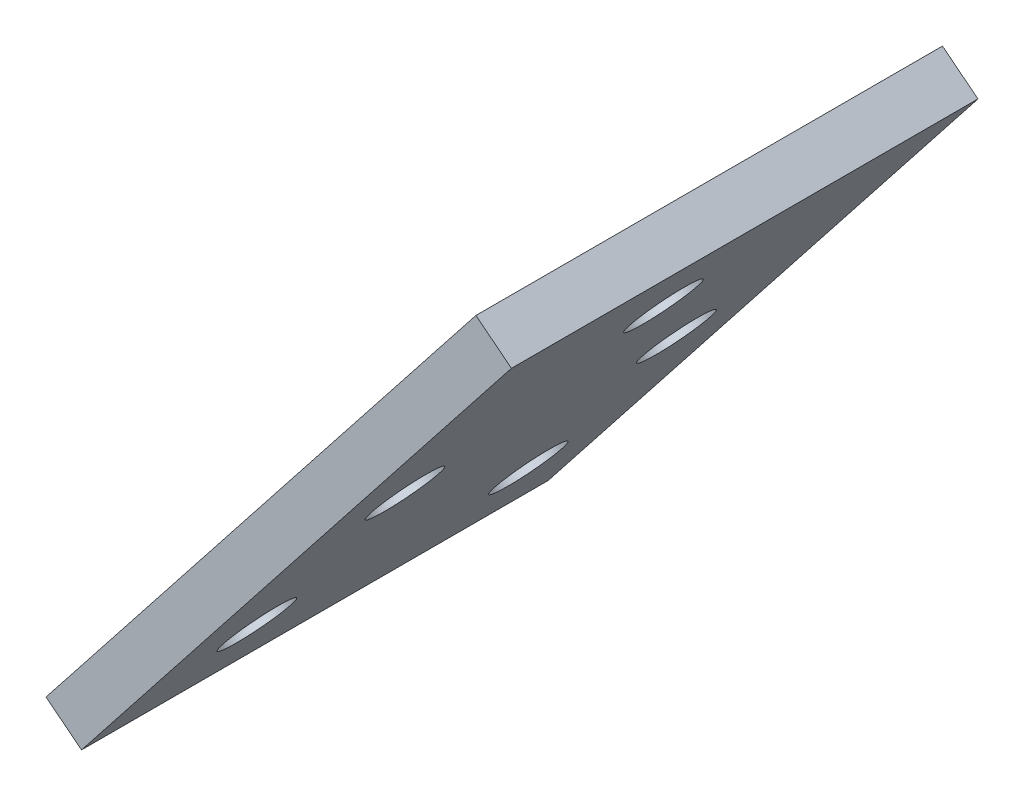
ISO-10303-21;
HEADER;
FILE_DESCRIPTION(('STEP AP214'),'2;1');
FILE_NAME('part.step','',(''),(''),'','','');
FILE_SCHEMA(('AUTOMOTIVE_DESIGN { 1 0 10303 214 1 1 1 1 }'));
ENDSEC;
DATA;
#1=APPLICATION_CONTEXT('core data for automotive mechanical design processes');
#2=APPLICATION_PROTOCOL_DEFINITION('international standard','automotive_design',2000,#1);
#3=PRODUCT_CONTEXT('',#1,'mechanical');
#4=PRODUCT('Part','Part','',(#3));
#5=PRODUCT_RELATED_PRODUCT_CATEGORY('part','',(#4));
#6=PRODUCT_DEFINITION_FORMATION('','',#4);
#7=PRODUCT_DEFINITION_CONTEXT('part definition',#1,'design');
#8=PRODUCT_DEFINITION('design','',#6,#7);
#9=PRODUCT_DEFINITION_SHAPE('','',#8);
#10=(LENGTH_UNIT() NAMED_UNIT(*) SI_UNIT(.MILLI.,.METRE.));
#11=(NAMED_UNIT(*) PLANE_ANGLE_UNIT() SI_UNIT($,.RADIAN.));
#12=(NAMED_UNIT(*) SI_UNIT($,.STERADIAN.) SOLID_ANGLE_UNIT());
#13=UNCERTAINTY_MEASURE_WITH_UNIT(LENGTH_MEASURE(1.E-05),#10,'distance_accuracy_value','');
#14=(GEOMETRIC_REPRESENTATION_CONTEXT(3) GLOBAL_UNCERTAINTY_ASSIGNED_CONTEXT((#13)) GLOBAL_UNIT_ASSIGNED_CONTEXT((#10,
#11,#12)) REPRESENTATION_CONTEXT('',''));
#15=CARTESIAN_POINT('',(0.,0.,0.));
#16=DIRECTION('',(0.,0.,1.));
#17=DIRECTION('',(1.,0.,0.));
#18=AXIS2_PLACEMENT_3D('',#15,#16,#17);
#19=CARTESIAN_POINT('',(1059.31573815368,-834.916688530996,0.));
#20=DIRECTION('',(-0.785381990859347,0.619011412199976,0.));
#21=DIRECTION('',(-0.619011412199976,-0.785381990859347,0.));
#22=AXIS2_PLACEMENT_3D('',#19,#20,#21);
#23=PLANE('',#22);
#24=CARTESIAN_POINT('',(2098.35710282422,483.385946100461,531.259663272656));
#25=DIRECTION('',(-0.785381990859347,0.619011412199975,0.));
#26=DIRECTION('',(-0.619011412199975,-0.785381990859347,0.));
#27=AXIS2_PLACEMENT_3D('',#24,#25,#26);
#28=CIRCLE('',#27,4.76249999999999);
#29=CARTESIAN_POINT('',(2095.40906097362,479.645564368993,531.259663272656));
#30=VERTEX_POINT('',#29);
#31=EDGE_CURVE('E133',#30,#30,#28,.T.);
#32=ORIENTED_EDGE('',*,*,#31,.F.);
#33=EDGE_LOOP('',(#32));
#34=FACE_BOUND('',#33,.T.);
#35=CARTESIAN_POINT('',(2119.14630906955,509.76262974077,493.159663272656));
#36=DIRECTION('',(-0.785381990859347,0.619011412199975,0.));
#37=DIRECTION('',(-0.619011412199975,-0.785381990859347,0.));
#38=AXIS2_PLACEMENT_3D('',#35,#36,#37);
#39=CIRCLE('',#38,4.76249999999999);
#40=CARTESIAN_POINT('',(2116.19826721895,506.022248009302,493.159663272656));
#41=VERTEX_POINT('',#40);
#42=EDGE_CURVE('E121',#41,#41,#39,.T.);
#43=ORIENTED_EDGE('',*,*,#42,.F.);
#44=EDGE_LOOP('',(#43));
#45=FACE_BOUND('',#44,.T.);
#46=DIRECTION('',(-0.619011412199975,-0.785381990859347,0.));
#47=VECTOR('',#46,1.);
#48=CARTESIAN_POINT('',(2147.76876175859,546.077887316234,479.477350202418));
#49=LINE('',#48,#47);
#50=CARTESIAN_POINT('',(2147.76876175859,546.077887316234,479.477350202418));
#51=VERTEX_POINT('',#50);
#52=CARTESIAN_POINT('',(2087.44633107142,469.5427059402,479.477350202418));
#53=VERTEX_POINT('',#52);
#54=EDGE_CURVE('E91',#51,#53,#49,.T.);
#55=ORIENTED_EDGE('',*,*,#54,.T.);
#56=DIRECTION('',(0.,0.,1.));
#57=VECTOR('',#56,1.);
#58=CARTESIAN_POINT('',(2087.44633107142,469.5427059402,479.477350202418));
#59=LINE('',#58,#57);
#60=CARTESIAN_POINT('',(2087.44633107142,469.5427059402,544.941976342895));
#61=VERTEX_POINT('',#60);
#62=EDGE_CURVE('E86',#53,#61,#59,.T.);
#63=ORIENTED_EDGE('',*,*,#62,.T.);
#64=DIRECTION('',(0.619011412199975,0.785381990859347,0.));
#65=VECTOR('',#64,1.);
#66=CARTESIAN_POINT('',(2147.76876175859,546.077887316234,544.941976342895));
#67=LINE('',#66,#65);
#68=CARTESIAN_POINT('',(2147.76876175859,546.077887316234,544.941976342895));
#69=VERTEX_POINT('',#68);
#70=EDGE_CURVE('E89',#61,#69,#67,.T.);
#71=ORIENTED_EDGE('',*,*,#70,.T.);
#72=DIRECTION('',(0.,0.,-1.));
#73=VECTOR('',#72,1.);
#74=CARTESIAN_POINT('',(2147.76876175859,546.077887316234,479.477350202418));
#75=LINE('',#74,#73);
#76=EDGE_CURVE('E56',#69,#51,#75,.T.);
#77=ORIENTED_EDGE('',*,*,#76,.T.);
#78=EDGE_LOOP('',(#55,#63,#71,#77));
#79=FACE_BOUND('',#78,.T.);
#80=CARTESIAN_POINT('',(2136.36236998439,531.605820237053,512.209663272656));
#81=DIRECTION('',(-0.785381990859347,0.619011412199975,0.));
#82=DIRECTION('',(-0.619011412199975,-0.785381990859347,0.));
#83=AXIS2_PLACEMENT_3D('',#80,#81,#82);
#84=CIRCLE('',#83,4.76250000000007);
#85=CARTESIAN_POINT('',(2133.41432813379,527.865438505585,512.209663272656));
#86=VERTEX_POINT('',#85);
#87=EDGE_CURVE('E106',#86,#86,#84,.T.);
#88=ORIENTED_EDGE('',*,*,#87,.F.);
#89=EDGE_LOOP('',(#88));
#90=FACE_BOUND('',#89,.T.);
#91=CARTESIAN_POINT('',(2119.14630906955,509.76262974077,531.259663272656));
#92=DIRECTION('',(-0.785381990859347,0.619011412199975,0.));
#93=DIRECTION('',(-0.619011412199975,-0.785381990859347,0.));
#94=AXIS2_PLACEMENT_3D('',#91,#92,#93);
#95=CIRCLE('',#94,4.76249999999999);
#96=CARTESIAN_POINT('',(2116.19826721895,506.022248009302,531.259663272656));
#97=VERTEX_POINT('',#96);
#98=EDGE_CURVE('E127',#97,#97,#95,.T.);
#99=ORIENTED_EDGE('',*,*,#98,.F.);
#100=EDGE_LOOP('',(#99));
#101=FACE_BOUND('',#100,.T.);
#102=CARTESIAN_POINT('',(2098.35710282422,483.385946100461,493.159663272656));
#103=DIRECTION('',(-0.785381990859347,0.619011412199975,0.));
#104=DIRECTION('',(-0.619011412199975,-0.785381990859347,0.));
#105=AXIS2_PLACEMENT_3D('',#102,#103,#104);
#106=CIRCLE('',#105,4.76249999999999);
#107=CARTESIAN_POINT('',(2095.40906097362,479.645564368993,493.159663272656));
#108=VERTEX_POINT('',#107);
#109=EDGE_CURVE('E139',#108,#108,#106,.T.);
#110=ORIENTED_EDGE('',*,*,#109,.F.);
#111=EDGE_LOOP('',(#110));
#112=FACE_BOUND('',#111,.T.);
#113=ADVANCED_FACE('F39',(#34,#45,#79,#90,#101,#112),#23,.T.);
#114=CARTESIAN_POINT('',(1064.30291379563,-838.847410998466,0.));
#115=DIRECTION('',(-0.785381990859347,0.619011412199976,0.));
#116=DIRECTION('',(-0.619011412199976,-0.785381990859347,0.));
#117=AXIS2_PLACEMENT_3D('',#114,#115,#116);
#118=PLANE('',#117);
#119=DIRECTION('',(-0.619011412199975,-0.785381990859347,0.));
#120=VECTOR('',#119,1.);
#121=CARTESIAN_POINT('',(2152.75593740054,542.147164848764,479.477350202418));
#122=LINE('',#121,#120);
#123=CARTESIAN_POINT('',(2152.75593740054,542.147164848764,479.477350202418));
#124=VERTEX_POINT('',#123);
#125=CARTESIAN_POINT('',(2092.43350671338,465.61198347273,479.477350202418));
#126=VERTEX_POINT('',#125);
#127=EDGE_CURVE('E103',#124,#126,#122,.T.);
#128=ORIENTED_EDGE('',*,*,#127,.F.);
#129=DIRECTION('',(0.,0.,-1.));
#130=VECTOR('',#129,1.);
#131=CARTESIAN_POINT('',(2152.75593740054,542.147164848764,479.477350202418));
#132=LINE('',#131,#130);
#133=CARTESIAN_POINT('',(2152.75593740054,542.147164848764,544.941976342895));
#134=VERTEX_POINT('',#133);
#135=EDGE_CURVE('E79',#134,#124,#132,.T.);
#136=ORIENTED_EDGE('',*,*,#135,.F.);
#137=DIRECTION('',(0.619011412199975,0.785381990859347,0.));
#138=VECTOR('',#137,1.);
#139=CARTESIAN_POINT('',(2152.75593740054,542.147164848764,544.941976342895));
#140=LINE('',#139,#138);
#141=CARTESIAN_POINT('',(2092.43350671338,465.61198347273,544.941976342895));
#142=VERTEX_POINT('',#141);
#143=EDGE_CURVE('E73',#142,#134,#140,.T.);
#144=ORIENTED_EDGE('',*,*,#143,.F.);
#145=DIRECTION('',(0.,0.,1.));
#146=VECTOR('',#145,1.);
#147=CARTESIAN_POINT('',(2092.43350671338,465.61198347273,479.477350202418));
#148=LINE('',#147,#146);
#149=EDGE_CURVE('E95',#126,#142,#148,.T.);
#150=ORIENTED_EDGE('',*,*,#149,.F.);
#151=EDGE_LOOP('',(#128,#136,#144,#150));
#152=FACE_BOUND('',#151,.T.);
#153=CARTESIAN_POINT('',(2141.34954562635,527.675097769583,512.209663272656));
#154=DIRECTION('',(-0.785381990859347,0.619011412199975,0.));
#155=DIRECTION('',(-0.619011412199975,-0.785381990859347,0.));
#156=AXIS2_PLACEMENT_3D('',#153,#154,#155);
#157=CIRCLE('',#156,4.76250000000007);
#158=CARTESIAN_POINT('',(2138.40150377575,523.934716038115,512.209663272656));
#159=VERTEX_POINT('',#158);
#160=EDGE_CURVE('E118',#159,#159,#157,.T.);
#161=ORIENTED_EDGE('',*,*,#160,.T.);
#162=EDGE_LOOP('',(#161));
#163=FACE_BOUND('',#162,.T.);
#164=CARTESIAN_POINT('',(2124.13348471151,505.8319072733,493.159663272656));
#165=DIRECTION('',(-0.785381990859347,0.619011412199975,0.));
#166=DIRECTION('',(-0.619011412199975,-0.785381990859347,0.));
#167=AXIS2_PLACEMENT_3D('',#164,#165,#166);
#168=CIRCLE('',#167,4.76249999999999);
#169=CARTESIAN_POINT('',(2121.1854428609,502.091525541832,493.159663272656));
#170=VERTEX_POINT('',#169);
#171=EDGE_CURVE('E124',#170,#170,#168,.T.);
#172=ORIENTED_EDGE('',*,*,#171,.T.);
#173=EDGE_LOOP('',(#172));
#174=FACE_BOUND('',#173,.T.);
#175=CARTESIAN_POINT('',(2124.13348471151,505.8319072733,531.259663272656));
#176=DIRECTION('',(-0.785381990859347,0.619011412199975,0.));
#177=DIRECTION('',(-0.619011412199975,-0.785381990859347,0.));
#178=AXIS2_PLACEMENT_3D('',#175,#176,#177);
#179=CIRCLE('',#178,4.76249999999999);
#180=CARTESIAN_POINT('',(2121.1854428609,502.091525541832,531.259663272656));
#181=VERTEX_POINT('',#180);
#182=EDGE_CURVE('E130',#181,#181,#179,.T.);
#183=ORIENTED_EDGE('',*,*,#182,.T.);
#184=EDGE_LOOP('',(#183));
#185=FACE_BOUND('',#184,.T.);
#186=CARTESIAN_POINT('',(2103.34427846618,479.455223632991,531.259663272656));
#187=DIRECTION('',(-0.785381990859347,0.619011412199975,0.));
#188=DIRECTION('',(-0.619011412199975,-0.785381990859347,0.));
#189=AXIS2_PLACEMENT_3D('',#186,#187,#188);
#190=CIRCLE('',#189,4.76249999999999);
#191=CARTESIAN_POINT('',(2100.39623661558,475.714841901523,531.259663272656));
#192=VERTEX_POINT('',#191);
#193=EDGE_CURVE('E136',#192,#192,#190,.T.);
#194=ORIENTED_EDGE('',*,*,#193,.T.);
#195=EDGE_LOOP('',(#194));
#196=FACE_BOUND('',#195,.T.);
#197=CARTESIAN_POINT('',(2103.34427846618,479.455223632991,493.159663272656));
#198=DIRECTION('',(-0.785381990859347,0.619011412199975,0.));
#199=DIRECTION('',(-0.619011412199975,-0.785381990859347,0.));
#200=AXIS2_PLACEMENT_3D('',#197,#198,#199);
#201=CIRCLE('',#200,4.76249999999999);
#202=CARTESIAN_POINT('',(2100.39623661558,475.714841901523,493.159663272656));
#203=VERTEX_POINT('',#202);
#204=EDGE_CURVE('E142',#203,#203,#201,.T.);
#205=ORIENTED_EDGE('',*,*,#204,.T.);
#206=EDGE_LOOP('',(#205));
#207=FACE_BOUND('',#206,.T.);
#208=ADVANCED_FACE('F114',(#152,#163,#174,#185,#196,#207),#118,.F.);
#209=CARTESIAN_POINT('',(2147.76876175859,546.077887316234,479.477350202418));
#210=DIRECTION('',(0.,0.,1.));
#211=DIRECTION('',(0.,-1.,0.));
#212=AXIS2_PLACEMENT_3D('',#209,#210,#211);
#213=PLANE('',#212);
#214=ORIENTED_EDGE('',*,*,#127,.T.);
#215=DIRECTION('',(0.785381990859347,-0.619011412199975,0.));
#216=VECTOR('',#215,1.);
#217=CARTESIAN_POINT('',(2087.44633107142,469.5427059402,479.477350202418));
#218=LINE('',#217,#216);
#219=EDGE_CURVE('E11',#53,#126,#218,.T.);
#220=ORIENTED_EDGE('',*,*,#219,.F.);
#221=ORIENTED_EDGE('',*,*,#54,.F.);
#222=DIRECTION('',(0.785381990859347,-0.619011412199975,0.));
#223=VECTOR('',#222,1.);
#224=CARTESIAN_POINT('',(2147.76876175859,546.077887316234,479.477350202418));
#225=LINE('',#224,#223);
#226=EDGE_CURVE('E99',#51,#124,#225,.T.);
#227=ORIENTED_EDGE('',*,*,#226,.T.);
#228=EDGE_LOOP('',(#214,#220,#221,#227));
#229=FACE_BOUND('',#228,.T.);
#230=ADVANCED_FACE('F41',(#229),#213,.F.);
#231=CARTESIAN_POINT('',(2087.44633107142,469.5427059402,479.477350202418));
#232=DIRECTION('',(0.619011412199975,0.785381990859347,0.));
#233=DIRECTION('',(-0.785381990859347,0.619011412199975,0.));
#234=AXIS2_PLACEMENT_3D('',#231,#232,#233);
#235=PLANE('',#234);
#236=ORIENTED_EDGE('',*,*,#149,.T.);
#237=DIRECTION('',(0.785381990859347,-0.619011412199975,0.));
#238=VECTOR('',#237,1.);
#239=CARTESIAN_POINT('',(2087.44633107142,469.5427059402,544.941976342895));
#240=LINE('',#239,#238);
#241=EDGE_CURVE('E48',#61,#142,#240,.T.);
#242=ORIENTED_EDGE('',*,*,#241,.F.);
#243=ORIENTED_EDGE('',*,*,#62,.F.);
#244=ORIENTED_EDGE('',*,*,#219,.T.);
#245=EDGE_LOOP('',(#236,#242,#243,#244));
#246=FACE_BOUND('',#245,.T.);
#247=ADVANCED_FACE('F94',(#246),#235,.F.);
#248=CARTESIAN_POINT('',(2147.76876175859,546.077887316234,544.941976342895));
#249=DIRECTION('',(0.,0.,-1.));
#250=DIRECTION('',(-1.,0.,0.));
#251=AXIS2_PLACEMENT_3D('',#248,#249,#250);
#252=PLANE('',#251);
#253=ORIENTED_EDGE('',*,*,#143,.T.);
#254=DIRECTION('',(0.785381990859347,-0.619011412199975,0.));
#255=VECTOR('',#254,1.);
#256=CARTESIAN_POINT('',(2147.76876175859,546.077887316234,544.941976342895));
#257=LINE('',#256,#255);
#258=EDGE_CURVE('E96',#69,#134,#257,.T.);
#259=ORIENTED_EDGE('',*,*,#258,.F.);
#260=ORIENTED_EDGE('',*,*,#70,.F.);
#261=ORIENTED_EDGE('',*,*,#241,.T.);
#262=EDGE_LOOP('',(#253,#259,#260,#261));
#263=FACE_BOUND('',#262,.T.);
#264=ADVANCED_FACE('F97',(#263),#252,.F.);
#265=CARTESIAN_POINT('',(2147.76876175859,546.077887316234,479.477350202418));
#266=DIRECTION('',(-0.619011412199975,-0.785381990859347,0.));
#267=DIRECTION('',(0.785381990859347,-0.619011412199975,0.));
#268=AXIS2_PLACEMENT_3D('',#265,#266,#267);
#269=PLANE('',#268);
#270=ORIENTED_EDGE('',*,*,#135,.T.);
#271=ORIENTED_EDGE('',*,*,#226,.F.);
#272=ORIENTED_EDGE('',*,*,#76,.F.);
#273=ORIENTED_EDGE('',*,*,#258,.T.);
#274=EDGE_LOOP('',(#270,#271,#272,#273));
#275=FACE_BOUND('',#274,.T.);
#276=ADVANCED_FACE('F111',(#275),#269,.F.);
#277=CARTESIAN_POINT('',(2136.36236998439,531.605820237053,512.209663272656));
#278=DIRECTION('',(0.785381990859347,-0.619011412199975,0.));
#279=DIRECTION('',(0.619011412199975,0.785381990859347,0.));
#280=AXIS2_PLACEMENT_3D('',#277,#278,#279);
#281=CYLINDRICAL_SURFACE('',#280,4.76250000000007);
#282=ORIENTED_EDGE('',*,*,#87,.T.);
#283=EDGE_LOOP('',(#282));
#284=FACE_BOUND('',#283,.T.);
#285=ORIENTED_EDGE('',*,*,#160,.F.);
#286=EDGE_LOOP('',(#285));
#287=FACE_BOUND('',#286,.T.);
#288=ADVANCED_FACE('F161',(#284,#287),#281,.F.);
#289=CARTESIAN_POINT('',(2119.14630906955,509.76262974077,493.159663272656));
#290=DIRECTION('',(0.785381990859347,-0.619011412199975,0.));
#291=DIRECTION('',(0.619011412199975,0.785381990859347,0.));
#292=AXIS2_PLACEMENT_3D('',#289,#290,#291);
#293=CYLINDRICAL_SURFACE('',#292,4.76249999999999);
#294=ORIENTED_EDGE('',*,*,#42,.T.);
#295=EDGE_LOOP('',(#294));
#296=FACE_BOUND('',#295,.T.);
#297=ORIENTED_EDGE('',*,*,#171,.F.);
#298=EDGE_LOOP('',(#297));
#299=FACE_BOUND('',#298,.T.);
#300=ADVANCED_FACE('F206',(#296,#299),#293,.F.);
#301=CARTESIAN_POINT('',(2119.14630906955,509.76262974077,531.259663272656));
#302=DIRECTION('',(0.785381990859347,-0.619011412199975,0.));
#303=DIRECTION('',(0.619011412199975,0.785381990859347,0.));
#304=AXIS2_PLACEMENT_3D('',#301,#302,#303);
#305=CYLINDRICAL_SURFACE('',#304,4.76249999999999);
#306=ORIENTED_EDGE('',*,*,#98,.T.);
#307=EDGE_LOOP('',(#306));
#308=FACE_BOUND('',#307,.T.);
#309=ORIENTED_EDGE('',*,*,#182,.F.);
#310=EDGE_LOOP('',(#309));
#311=FACE_BOUND('',#310,.T.);
#312=ADVANCED_FACE('F214',(#308,#311),#305,.F.);
#313=CARTESIAN_POINT('',(2098.35710282422,483.385946100461,531.259663272656));
#314=DIRECTION('',(0.785381990859347,-0.619011412199975,0.));
#315=DIRECTION('',(0.619011412199975,0.785381990859347,0.));
#316=AXIS2_PLACEMENT_3D('',#313,#314,#315);
#317=CYLINDRICAL_SURFACE('',#316,4.76249999999999);
#318=ORIENTED_EDGE('',*,*,#31,.T.);
#319=EDGE_LOOP('',(#318));
#320=FACE_BOUND('',#319,.T.);
#321=ORIENTED_EDGE('',*,*,#193,.F.);
#322=EDGE_LOOP('',(#321));
#323=FACE_BOUND('',#322,.T.);
#324=ADVANCED_FACE('F222',(#320,#323),#317,.F.);
#325=CARTESIAN_POINT('',(2098.35710282422,483.385946100461,493.159663272656));
#326=DIRECTION('',(0.785381990859347,-0.619011412199975,0.));
#327=DIRECTION('',(0.619011412199975,0.785381990859347,0.));
#328=AXIS2_PLACEMENT_3D('',#325,#326,#327);
#329=CYLINDRICAL_SURFACE('',#328,4.76249999999999);
#330=ORIENTED_EDGE('',*,*,#109,.T.);
#331=EDGE_LOOP('',(#330));
#332=FACE_BOUND('',#331,.T.);
#333=ORIENTED_EDGE('',*,*,#204,.F.);
#334=EDGE_LOOP('',(#333));
#335=FACE_BOUND('',#334,.T.);
#336=ADVANCED_FACE('F148',(#332,#335),#329,.F.);
#337=CLOSED_SHELL('',(#113,#208,#230,#247,#264,#276,#288,#300,#312,#324,#336));
#338=MANIFOLD_SOLID_BREP('B2',#337);
#339=ADVANCED_BREP_SHAPE_REPRESENTATION('',(#18,#338),#14);
#340=SHAPE_DEFINITION_REPRESENTATION(#9,#339);
ENDSEC;
END-ISO-10303-21;
